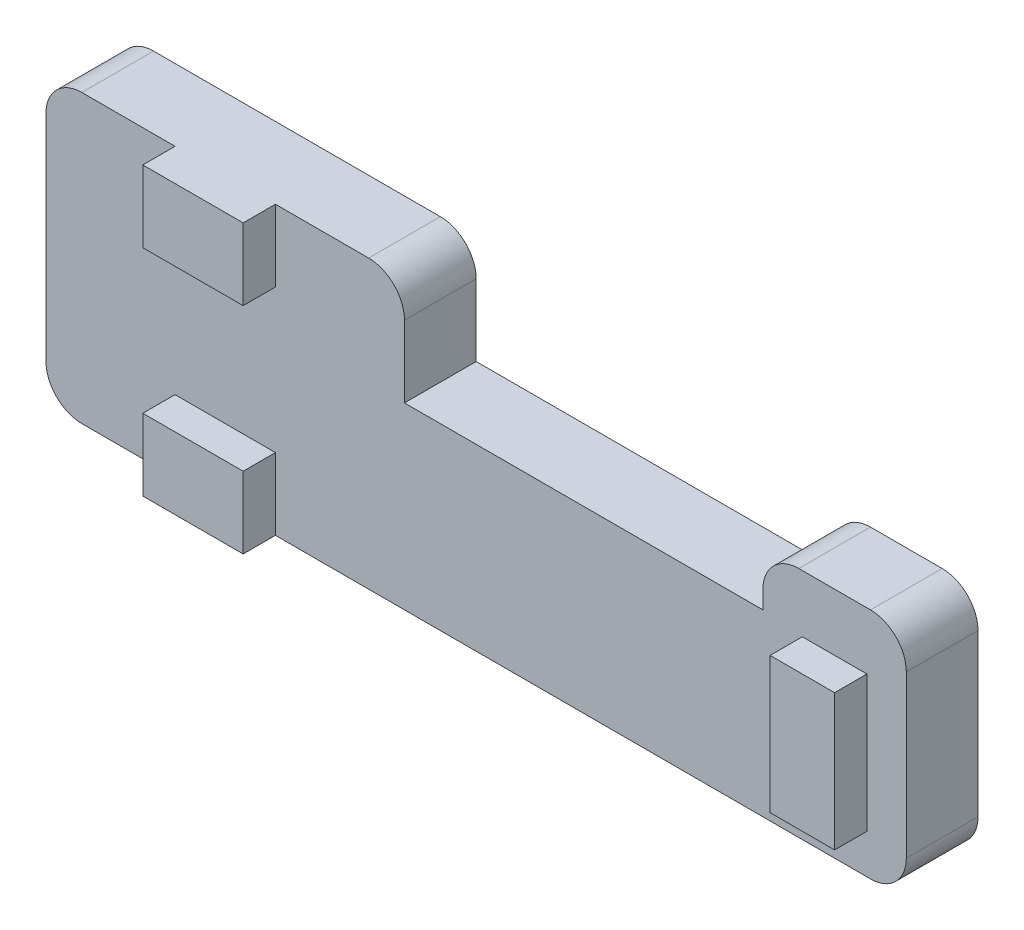
ISO-10303-21;
HEADER;
FILE_DESCRIPTION(('STEP AP214'),'2;1');
FILE_NAME('part.step','',(''),(''),'','','');
FILE_SCHEMA(('AUTOMOTIVE_DESIGN { 1 0 10303 214 1 1 1 1 }'));
ENDSEC;
DATA;
#1=APPLICATION_CONTEXT('core data for automotive mechanical design processes');
#2=APPLICATION_PROTOCOL_DEFINITION('international standard','automotive_design',2000,#1);
#3=PRODUCT_CONTEXT('',#1,'mechanical');
#4=PRODUCT('Part','Part','',(#3));
#5=PRODUCT_RELATED_PRODUCT_CATEGORY('part','',(#4));
#6=PRODUCT_DEFINITION_FORMATION('','',#4);
#7=PRODUCT_DEFINITION_CONTEXT('part definition',#1,'design');
#8=PRODUCT_DEFINITION('design','',#6,#7);
#9=PRODUCT_DEFINITION_SHAPE('','',#8);
#10=(LENGTH_UNIT() NAMED_UNIT(*) SI_UNIT(.MILLI.,.METRE.));
#11=(NAMED_UNIT(*) PLANE_ANGLE_UNIT() SI_UNIT($,.RADIAN.));
#12=(NAMED_UNIT(*) SI_UNIT($,.STERADIAN.) SOLID_ANGLE_UNIT());
#13=UNCERTAINTY_MEASURE_WITH_UNIT(LENGTH_MEASURE(1.E-05),#10,'distance_accuracy_value','');
#14=(GEOMETRIC_REPRESENTATION_CONTEXT(3) GLOBAL_UNCERTAINTY_ASSIGNED_CONTEXT((#13)) GLOBAL_UNIT_ASSIGNED_CONTEXT((#10,
#11,#12)) REPRESENTATION_CONTEXT('',''));
#15=CARTESIAN_POINT('',(0.,0.,0.));
#16=DIRECTION('',(0.,0.,1.));
#17=DIRECTION('',(1.,0.,0.));
#18=AXIS2_PLACEMENT_3D('',#15,#16,#17);
#19=CARTESIAN_POINT('',(0.,1.1,-17.1));
#20=DIRECTION('',(0.,-1.,0.));
#21=DIRECTION('',(1.,0.,0.));
#22=AXIS2_PLACEMENT_3D('',#19,#20,#21);
#23=PLANE('',#22);
#24=DIRECTION('',(0.,0.,1.));
#25=VECTOR('',#24,1.);
#26=CARTESIAN_POINT('',(11.1,1.1,-18.));
#27=LINE('',#26,#25);
#28=CARTESIAN_POINT('',(11.1,1.1,-18.));
#29=VERTEX_POINT('',#28);
#30=CARTESIAN_POINT('',(11.1,1.1,-17.1));
#31=VERTEX_POINT('',#30);
#32=EDGE_CURVE('E256',#29,#31,#27,.T.);
#33=ORIENTED_EDGE('',*,*,#32,.F.);
#34=DIRECTION('',(-1.,0.,0.));
#35=VECTOR('',#34,1.);
#36=CARTESIAN_POINT('',(0.,1.1,-18.));
#37=LINE('',#36,#35);
#38=CARTESIAN_POINT('',(12.9,1.1,-18.));
#39=VERTEX_POINT('',#38);
#40=EDGE_CURVE('E270',#39,#29,#37,.T.);
#41=ORIENTED_EDGE('',*,*,#40,.F.);
#42=DIRECTION('',(0.,0.,1.));
#43=VECTOR('',#42,1.);
#44=CARTESIAN_POINT('',(12.9,1.1,-18.));
#45=LINE('',#44,#43);
#46=CARTESIAN_POINT('',(12.9,1.1,-17.1));
#47=VERTEX_POINT('',#46);
#48=EDGE_CURVE('E488',#39,#47,#45,.T.);
#49=ORIENTED_EDGE('',*,*,#48,.T.);
#50=DIRECTION('',(-1.,0.,0.));
#51=VECTOR('',#50,1.);
#52=CARTESIAN_POINT('',(0.,1.1,-17.1));
#53=LINE('',#52,#51);
#54=EDGE_CURVE('E272',#47,#31,#53,.T.);
#55=ORIENTED_EDGE('',*,*,#54,.T.);
#56=EDGE_LOOP('',(#33,#41,#49,#55));
#57=FACE_BOUND('',#56,.T.);
#58=ADVANCED_FACE('F82',(#57),#23,.T.);
#59=CARTESIAN_POINT('',(0.,4.9,-17.1));
#60=DIRECTION('',(0.,-1.,0.));
#61=DIRECTION('',(0.,0.,-1.));
#62=AXIS2_PLACEMENT_3D('',#59,#60,#61);
#63=PLANE('',#62);
#64=DIRECTION('',(-1.,0.,0.));
#65=VECTOR('',#64,1.);
#66=CARTESIAN_POINT('',(0.,4.9,-18.));
#67=LINE('',#66,#65);
#68=CARTESIAN_POINT('',(12.9,4.9,-18.));
#69=VERTEX_POINT('',#68);
#70=CARTESIAN_POINT('',(11.1,4.9,-18.));
#71=VERTEX_POINT('',#70);
#72=EDGE_CURVE('E277',#69,#71,#67,.T.);
#73=ORIENTED_EDGE('',*,*,#72,.T.);
#74=DIRECTION('',(0.,0.,1.));
#75=VECTOR('',#74,1.);
#76=CARTESIAN_POINT('',(11.1,4.9,-18.));
#77=LINE('',#76,#75);
#78=CARTESIAN_POINT('',(11.1,4.9,-17.1));
#79=VERTEX_POINT('',#78);
#80=EDGE_CURVE('E259',#71,#79,#77,.T.);
#81=ORIENTED_EDGE('',*,*,#80,.T.);
#82=DIRECTION('',(-1.,0.,0.));
#83=VECTOR('',#82,1.);
#84=CARTESIAN_POINT('',(0.,4.9,-17.1));
#85=LINE('',#84,#83);
#86=CARTESIAN_POINT('',(12.9,4.9,-17.1));
#87=VERTEX_POINT('',#86);
#88=EDGE_CURVE('E284',#87,#79,#85,.T.);
#89=ORIENTED_EDGE('',*,*,#88,.F.);
#90=DIRECTION('',(0.,0.,1.));
#91=VECTOR('',#90,1.);
#92=CARTESIAN_POINT('',(12.9,4.9,-18.));
#93=LINE('',#92,#91);
#94=EDGE_CURVE('E483',#69,#87,#93,.T.);
#95=ORIENTED_EDGE('',*,*,#94,.F.);
#96=EDGE_LOOP('',(#73,#81,#89,#95));
#97=FACE_BOUND('',#96,.T.);
#98=ADVANCED_FACE('F482',(#97),#63,.F.);
#99=CARTESIAN_POINT('',(0.,0.,-17.1));
#100=DIRECTION('',(0.,0.,1.));
#101=DIRECTION('',(1.,0.,0.));
#102=AXIS2_PLACEMENT_3D('',#99,#100,#101);
#103=PLANE('',#102);
#104=DIRECTION('',(0.,1.,0.));
#105=VECTOR('',#104,1.);
#106=CARTESIAN_POINT('',(11.1,0.,-17.1));
#107=LINE('',#106,#105);
#108=EDGE_CURVE('E264',#31,#79,#107,.T.);
#109=ORIENTED_EDGE('',*,*,#108,.F.);
#110=ORIENTED_EDGE('',*,*,#54,.F.);
#111=DIRECTION('',(0.,1.,0.));
#112=VECTOR('',#111,1.);
#113=CARTESIAN_POINT('',(12.9,0.,-17.1));
#114=LINE('',#113,#112);
#115=EDGE_CURVE('E479',#47,#87,#114,.T.);
#116=ORIENTED_EDGE('',*,*,#115,.T.);
#117=ORIENTED_EDGE('',*,*,#88,.T.);
#118=EDGE_LOOP('',(#109,#110,#116,#117));
#119=FACE_BOUND('',#118,.T.);
#120=ADVANCED_FACE('F478',(#119),#103,.T.);
#121=CARTESIAN_POINT('',(14.,0.,0.));
#122=DIRECTION('',(1.,0.,0.));
#123=DIRECTION('',(0.,0.,-1.));
#124=AXIS2_PLACEMENT_3D('',#121,#122,#123);
#125=PLANE('',#124);
#126=DIRECTION('',(0.,-1.,0.));
#127=VECTOR('',#126,1.);
#128=CARTESIAN_POINT('',(14.,6.5,-18.));
#129=LINE('',#128,#127);
#130=CARTESIAN_POINT('',(14.,5.5,-18.));
#131=VERTEX_POINT('',#130);
#132=CARTESIAN_POINT('',(14.,1.,-18.));
#133=VERTEX_POINT('',#132);
#134=EDGE_CURVE('E386',#131,#133,#129,.T.);
#135=ORIENTED_EDGE('',*,*,#134,.T.);
#136=DIRECTION('',(0.,0.,-1.));
#137=VECTOR('',#136,1.);
#138=CARTESIAN_POINT('',(14.,1.,-20.));
#139=LINE('',#138,#137);
#140=CARTESIAN_POINT('',(14.,1.,-20.));
#141=VERTEX_POINT('',#140);
#142=EDGE_CURVE('E354',#133,#141,#139,.T.);
#143=ORIENTED_EDGE('',*,*,#142,.T.);
#144=DIRECTION('',(0.,1.,0.));
#145=VECTOR('',#144,1.);
#146=CARTESIAN_POINT('',(14.,0.,-20.));
#147=LINE('',#146,#145);
#148=CARTESIAN_POINT('',(14.,5.5,-20.));
#149=VERTEX_POINT('',#148);
#150=EDGE_CURVE('E396',#141,#149,#147,.T.);
#151=ORIENTED_EDGE('',*,*,#150,.T.);
#152=DIRECTION('',(0.,0.,1.));
#153=VECTOR('',#152,1.);
#154=CARTESIAN_POINT('',(14.,5.5,-18.));
#155=LINE('',#154,#153);
#156=EDGE_CURVE('E351',#149,#131,#155,.T.);
#157=ORIENTED_EDGE('',*,*,#156,.T.);
#158=EDGE_LOOP('',(#135,#143,#151,#157));
#159=FACE_BOUND('',#158,.T.);
#160=ADVANCED_FACE('F393',(#159),#125,.T.);
#161=CARTESIAN_POINT('',(0.,2.,-18.));
#162=DIRECTION('',(0.,0.,1.));
#163=DIRECTION('',(1.,0.,0.));
#164=AXIS2_PLACEMENT_3D('',#161,#162,#163);
#165=PLANE('',#164);
#166=ORIENTED_EDGE('',*,*,#40,.T.);
#167=DIRECTION('',(0.,1.,0.));
#168=VECTOR('',#167,1.);
#169=CARTESIAN_POINT('',(11.1,0.,-18.));
#170=LINE('',#169,#168);
#171=EDGE_CURVE('E253',#29,#71,#170,.T.);
#172=ORIENTED_EDGE('',*,*,#171,.T.);
#173=ORIENTED_EDGE('',*,*,#72,.F.);
#174=DIRECTION('',(0.,1.,0.));
#175=VECTOR('',#174,1.);
#176=CARTESIAN_POINT('',(12.9,0.,-18.));
#177=LINE('',#176,#175);
#178=EDGE_CURVE('E276',#39,#69,#177,.T.);
#179=ORIENTED_EDGE('',*,*,#178,.F.);
#180=EDGE_LOOP('',(#166,#172,#173,#179));
#181=FACE_BOUND('',#180,.T.);
#182=DIRECTION('',(1.,0.,0.));
#183=VECTOR('',#182,1.);
#184=CARTESIAN_POINT('',(-10.,8.,-18.));
#185=LINE('',#184,#183);
#186=CARTESIAN_POINT('',(-9.,8.,-18.));
#187=VERTEX_POINT('',#186);
#188=CARTESIAN_POINT('',(-6.4,8.,-18.));
#189=VERTEX_POINT('',#188);
#190=EDGE_CURVE('E281',#187,#189,#185,.T.);
#191=ORIENTED_EDGE('',*,*,#190,.F.);
#192=CARTESIAN_POINT('',(-9.,7.,-18.));
#193=DIRECTION('',(0.,0.,1.));
#194=DIRECTION('',(1.,0.,0.));
#195=AXIS2_PLACEMENT_3D('',#192,#193,#194);
#196=CIRCLE('',#195,1.);
#197=CARTESIAN_POINT('',(-10.,7.,-18.));
#198=VERTEX_POINT('',#197);
#199=EDGE_CURVE('E345',#187,#198,#196,.T.);
#200=ORIENTED_EDGE('',*,*,#199,.T.);
#201=DIRECTION('',(0.,1.,0.));
#202=VECTOR('',#201,1.);
#203=CARTESIAN_POINT('',(-10.,0.,-18.));
#204=LINE('',#203,#202);
#205=CARTESIAN_POINT('',(-10.,1.,-18.));
#206=VERTEX_POINT('',#205);
#207=EDGE_CURVE('E471',#206,#198,#204,.T.);
#208=ORIENTED_EDGE('',*,*,#207,.F.);
#209=CARTESIAN_POINT('',(-9.,1.,-18.));
#210=DIRECTION('',(0.,0.,1.));
#211=DIRECTION('',(1.,0.,0.));
#212=AXIS2_PLACEMENT_3D('',#209,#210,#211);
#213=CIRCLE('',#212,1.);
#214=CARTESIAN_POINT('',(-9.,0.,-18.));
#215=VERTEX_POINT('',#214);
#216=EDGE_CURVE('E97',#206,#215,#213,.T.);
#217=ORIENTED_EDGE('',*,*,#216,.T.);
#218=DIRECTION('',(1.,0.,0.));
#219=VECTOR('',#218,1.);
#220=CARTESIAN_POINT('',(-10.,0.,-18.));
#221=LINE('',#220,#219);
#222=CARTESIAN_POINT('',(-6.4,0.,-18.));
#223=VERTEX_POINT('',#222);
#224=EDGE_CURVE('E278',#215,#223,#221,.T.);
#225=ORIENTED_EDGE('',*,*,#224,.T.);
#226=DIRECTION('',(0.,-1.,0.));
#227=VECTOR('',#226,1.);
#228=CARTESIAN_POINT('',(-6.4,0.,-18.));
#229=LINE('',#228,#227);
#230=CARTESIAN_POINT('',(-6.4,2.,-18.));
#231=VERTEX_POINT('',#230);
#232=EDGE_CURVE('E415',#231,#223,#229,.T.);
#233=ORIENTED_EDGE('',*,*,#232,.F.);
#234=DIRECTION('',(-1.,0.,0.));
#235=VECTOR('',#234,1.);
#236=CARTESIAN_POINT('',(-3.6,2.,-18.));
#237=LINE('',#236,#235);
#238=CARTESIAN_POINT('',(-3.6,2.,-18.));
#239=VERTEX_POINT('',#238);
#240=EDGE_CURVE('E424',#239,#231,#237,.T.);
#241=ORIENTED_EDGE('',*,*,#240,.F.);
#242=DIRECTION('',(0.,1.,0.));
#243=VECTOR('',#242,1.);
#244=CARTESIAN_POINT('',(-3.6,0.,-18.));
#245=LINE('',#244,#243);
#246=CARTESIAN_POINT('',(-3.6,0.,-18.));
#247=VERTEX_POINT('',#246);
#248=EDGE_CURVE('E410',#247,#239,#245,.T.);
#249=ORIENTED_EDGE('',*,*,#248,.F.);
#250=DIRECTION('',(-1.,0.,0.));
#251=VECTOR('',#250,1.);
#252=CARTESIAN_POINT('',(0.,0.,-18.));
#253=LINE('',#252,#251);
#254=CARTESIAN_POINT('',(13.,0.,-18.));
#255=VERTEX_POINT('',#254);
#256=EDGE_CURVE('E308',#255,#247,#253,.T.);
#257=ORIENTED_EDGE('',*,*,#256,.F.);
#258=CARTESIAN_POINT('',(13.,1.,-18.));
#259=DIRECTION('',(0.,0.,1.));
#260=DIRECTION('',(1.,0.,0.));
#261=AXIS2_PLACEMENT_3D('',#258,#259,#260);
#262=CIRCLE('',#261,1.);
#263=EDGE_CURVE('E342',#255,#133,#262,.T.);
#264=ORIENTED_EDGE('',*,*,#263,.T.);
#265=ORIENTED_EDGE('',*,*,#134,.F.);
#266=CARTESIAN_POINT('',(13.,5.5,-18.));
#267=DIRECTION('',(0.,0.,1.));
#268=DIRECTION('',(1.,0.,0.));
#269=AXIS2_PLACEMENT_3D('',#266,#267,#268);
#270=CIRCLE('',#269,1.);
#271=CARTESIAN_POINT('',(13.,6.5,-18.));
#272=VERTEX_POINT('',#271);
#273=EDGE_CURVE('E340',#131,#272,#270,.T.);
#274=ORIENTED_EDGE('',*,*,#273,.T.);
#275=DIRECTION('',(-1.,0.,0.));
#276=VECTOR('',#275,1.);
#277=CARTESIAN_POINT('',(0.,6.5,-18.));
#278=LINE('',#277,#276);
#279=CARTESIAN_POINT('',(11.,6.5,-18.));
#280=VERTEX_POINT('',#279);
#281=EDGE_CURVE('E293',#272,#280,#278,.T.);
#282=ORIENTED_EDGE('',*,*,#281,.T.);
#283=CARTESIAN_POINT('',(11.,5.5,-18.));
#284=DIRECTION('',(0.,0.,1.));
#285=DIRECTION('',(1.,0.,0.));
#286=AXIS2_PLACEMENT_3D('',#283,#284,#285);
#287=CIRCLE('',#286,1.);
#288=CARTESIAN_POINT('',(10.,5.5,-18.));
#289=VERTEX_POINT('',#288);
#290=EDGE_CURVE('E338',#280,#289,#287,.T.);
#291=ORIENTED_EDGE('',*,*,#290,.T.);
#292=DIRECTION('',(0.,1.,0.));
#293=VECTOR('',#292,1.);
#294=CARTESIAN_POINT('',(10.,2.,-18.));
#295=LINE('',#294,#293);
#296=CARTESIAN_POINT('',(10.,5.,-18.));
#297=VERTEX_POINT('',#296);
#298=EDGE_CURVE('E290',#297,#289,#295,.T.);
#299=ORIENTED_EDGE('',*,*,#298,.F.);
#300=DIRECTION('',(-1.,0.,0.));
#301=VECTOR('',#300,1.);
#302=CARTESIAN_POINT('',(12.,5.,-18.));
#303=LINE('',#302,#301);
#304=CARTESIAN_POINT('',(0.,5.,-18.));
#305=VERTEX_POINT('',#304);
#306=EDGE_CURVE('E405',#297,#305,#303,.T.);
#307=ORIENTED_EDGE('',*,*,#306,.T.);
#308=DIRECTION('',(0.,-1.,0.));
#309=VECTOR('',#308,1.);
#310=CARTESIAN_POINT('',(0.,0.,-18.));
#311=LINE('',#310,#309);
#312=CARTESIAN_POINT('',(0.,7.,-18.));
#313=VERTEX_POINT('',#312);
#314=EDGE_CURVE('E296',#313,#305,#311,.T.);
#315=ORIENTED_EDGE('',*,*,#314,.F.);
#316=CARTESIAN_POINT('',(-1.,7.,-18.));
#317=DIRECTION('',(0.,0.,1.));
#318=DIRECTION('',(1.,0.,0.));
#319=AXIS2_PLACEMENT_3D('',#316,#317,#318);
#320=CIRCLE('',#319,1.);
#321=CARTESIAN_POINT('',(-1.,8.,-18.));
#322=VERTEX_POINT('',#321);
#323=EDGE_CURVE('E336',#313,#322,#320,.T.);
#324=ORIENTED_EDGE('',*,*,#323,.T.);
#325=DIRECTION('',(1.,0.,0.));
#326=VECTOR('',#325,1.);
#327=CARTESIAN_POINT('',(-14.,8.,-18.));
#328=LINE('',#327,#326);
#329=CARTESIAN_POINT('',(-3.6,8.,-18.));
#330=VERTEX_POINT('',#329);
#331=EDGE_CURVE('E287',#330,#322,#328,.T.);
#332=ORIENTED_EDGE('',*,*,#331,.F.);
#333=DIRECTION('',(0.,1.,0.));
#334=VECTOR('',#333,1.);
#335=CARTESIAN_POINT('',(-3.6,8.,-18.));
#336=LINE('',#335,#334);
#337=CARTESIAN_POINT('',(-3.6,6.,-18.));
#338=VERTEX_POINT('',#337);
#339=EDGE_CURVE('E440',#338,#330,#336,.T.);
#340=ORIENTED_EDGE('',*,*,#339,.F.);
#341=DIRECTION('',(1.,0.,0.));
#342=VECTOR('',#341,1.);
#343=CARTESIAN_POINT('',(-3.6,6.,-18.));
#344=LINE('',#343,#342);
#345=CARTESIAN_POINT('',(-6.4,6.,-18.));
#346=VERTEX_POINT('',#345);
#347=EDGE_CURVE('E445',#346,#338,#344,.T.);
#348=ORIENTED_EDGE('',*,*,#347,.F.);
#349=DIRECTION('',(0.,-1.,0.));
#350=VECTOR('',#349,1.);
#351=CARTESIAN_POINT('',(-6.4,8.,-18.));
#352=LINE('',#351,#350);
#353=EDGE_CURVE('E454',#189,#346,#352,.T.);
#354=ORIENTED_EDGE('',*,*,#353,.F.);
#355=EDGE_LOOP('',(#191,#200,#208,#217,#225,#233,#241,#249,#257,#264,#265,#274,#282,#291,#299,
#307,#315,#324,#332,#340,#348,#354));
#356=FACE_BOUND('',#355,.T.);
#357=ADVANCED_FACE('F275',(#181,#356),#165,.T.);
#358=CARTESIAN_POINT('',(0.,0.,0.));
#359=DIRECTION('',(0.,1.,0.));
#360=DIRECTION('',(0.,0.,1.));
#361=AXIS2_PLACEMENT_3D('',#358,#359,#360);
#362=PLANE('',#361);
#363=ORIENTED_EDGE('',*,*,#224,.F.);
#364=DIRECTION('',(0.,0.,1.));
#365=VECTOR('',#364,1.);
#366=CARTESIAN_POINT('',(-9.,0.,-20.));
#367=LINE('',#366,#365);
#368=CARTESIAN_POINT('',(-9.,0.,-20.));
#369=VERTEX_POINT('',#368);
#370=EDGE_CURVE('E349',#215,#369,#367,.F.);
#371=ORIENTED_EDGE('',*,*,#370,.T.);
#372=DIRECTION('',(-1.,0.,0.));
#373=VECTOR('',#372,1.);
#374=CARTESIAN_POINT('',(0.,0.,-20.));
#375=LINE('',#374,#373);
#376=CARTESIAN_POINT('',(13.,0.,-20.));
#377=VERTEX_POINT('',#376);
#378=EDGE_CURVE('E310',#377,#369,#375,.T.);
#379=ORIENTED_EDGE('',*,*,#378,.F.);
#380=DIRECTION('',(0.,0.,-1.));
#381=VECTOR('',#380,1.);
#382=CARTESIAN_POINT('',(13.,0.,-18.));
#383=LINE('',#382,#381);
#384=EDGE_CURVE('E347',#377,#255,#383,.F.);
#385=ORIENTED_EDGE('',*,*,#384,.T.);
#386=ORIENTED_EDGE('',*,*,#256,.T.);
#387=DIRECTION('',(0.,0.,-1.));
#388=VECTOR('',#387,1.);
#389=CARTESIAN_POINT('',(-3.6,0.,-17.1));
#390=LINE('',#389,#388);
#391=CARTESIAN_POINT('',(-3.6,0.,-17.1));
#392=VERTEX_POINT('',#391);
#393=EDGE_CURVE('E437',#392,#247,#390,.T.);
#394=ORIENTED_EDGE('',*,*,#393,.F.);
#395=DIRECTION('',(1.,0.,0.));
#396=VECTOR('',#395,1.);
#397=CARTESIAN_POINT('',(-3.6,0.,-17.1));
#398=LINE('',#397,#396);
#399=CARTESIAN_POINT('',(-6.4,0.,-17.1));
#400=VERTEX_POINT('',#399);
#401=EDGE_CURVE('E411',#400,#392,#398,.T.);
#402=ORIENTED_EDGE('',*,*,#401,.F.);
#403=DIRECTION('',(0.,0.,-1.));
#404=VECTOR('',#403,1.);
#405=CARTESIAN_POINT('',(-6.4,0.,-17.1));
#406=LINE('',#405,#404);
#407=EDGE_CURVE('E421',#400,#223,#406,.T.);
#408=ORIENTED_EDGE('',*,*,#407,.T.);
#409=EDGE_LOOP('',(#363,#371,#379,#385,#386,#394,#402,#408));
#410=FACE_BOUND('',#409,.T.);
#411=ADVANCED_FACE('F524',(#410),#362,.F.);
#412=CARTESIAN_POINT('',(10.,2.,0.));
#413=DIRECTION('',(-1.,0.,0.));
#414=DIRECTION('',(0.,0.,1.));
#415=AXIS2_PLACEMENT_3D('',#412,#413,#414);
#416=PLANE('',#415);
#417=ORIENTED_EDGE('',*,*,#298,.T.);
#418=DIRECTION('',(0.,0.,1.));
#419=VECTOR('',#418,1.);
#420=CARTESIAN_POINT('',(10.,5.5,-20.));
#421=LINE('',#420,#419);
#422=CARTESIAN_POINT('',(10.,5.5,-20.));
#423=VERTEX_POINT('',#422);
#424=EDGE_CURVE('E90',#289,#423,#421,.F.);
#425=ORIENTED_EDGE('',*,*,#424,.T.);
#426=DIRECTION('',(0.,-1.,0.));
#427=VECTOR('',#426,1.);
#428=CARTESIAN_POINT('',(10.,6.5,-20.));
#429=LINE('',#428,#427);
#430=CARTESIAN_POINT('',(10.,5.,-20.));
#431=VERTEX_POINT('',#430);
#432=EDGE_CURVE('E306',#423,#431,#429,.T.);
#433=ORIENTED_EDGE('',*,*,#432,.T.);
#434=DIRECTION('',(0.,0.,-1.));
#435=VECTOR('',#434,1.);
#436=CARTESIAN_POINT('',(10.,5.,0.));
#437=LINE('',#436,#435);
#438=EDGE_CURVE('E408',#297,#431,#437,.T.);
#439=ORIENTED_EDGE('',*,*,#438,.F.);
#440=EDGE_LOOP('',(#417,#425,#433,#439));
#441=FACE_BOUND('',#440,.T.);
#442=ADVANCED_FACE('F364',(#441),#416,.T.);
#443=CARTESIAN_POINT('',(0.,6.5,0.));
#444=DIRECTION('',(0.,-1.,0.));
#445=DIRECTION('',(0.,0.,-1.));
#446=AXIS2_PLACEMENT_3D('',#443,#444,#445);
#447=PLANE('',#446);
#448=ORIENTED_EDGE('',*,*,#281,.F.);
#449=DIRECTION('',(0.,0.,1.));
#450=VECTOR('',#449,1.);
#451=CARTESIAN_POINT('',(13.,6.5,-20.));
#452=LINE('',#451,#450);
#453=CARTESIAN_POINT('',(13.,6.5,-20.));
#454=VERTEX_POINT('',#453);
#455=EDGE_CURVE('E360',#272,#454,#452,.F.);
#456=ORIENTED_EDGE('',*,*,#455,.T.);
#457=DIRECTION('',(-1.,0.,0.));
#458=VECTOR('',#457,1.);
#459=CARTESIAN_POINT('',(12.,6.5,-20.));
#460=LINE('',#459,#458);
#461=CARTESIAN_POINT('',(11.,6.5,-20.));
#462=VERTEX_POINT('',#461);
#463=EDGE_CURVE('E303',#454,#462,#460,.T.);
#464=ORIENTED_EDGE('',*,*,#463,.T.);
#465=DIRECTION('',(0.,0.,1.));
#466=VECTOR('',#465,1.);
#467=CARTESIAN_POINT('',(11.,6.5,-18.));
#468=LINE('',#467,#466);
#469=EDGE_CURVE('E357',#462,#280,#468,.T.);
#470=ORIENTED_EDGE('',*,*,#469,.T.);
#471=EDGE_LOOP('',(#448,#456,#464,#470));
#472=FACE_BOUND('',#471,.T.);
#473=ADVANCED_FACE('F381',(#472),#447,.F.);
#474=CARTESIAN_POINT('',(0.,0.,0.));
#475=DIRECTION('',(-1.,0.,0.));
#476=DIRECTION('',(0.,0.,1.));
#477=AXIS2_PLACEMENT_3D('',#474,#475,#476);
#478=PLANE('',#477);
#479=DIRECTION('',(0.,-1.,0.));
#480=VECTOR('',#479,1.);
#481=CARTESIAN_POINT('',(0.,0.,-20.));
#482=LINE('',#481,#480);
#483=CARTESIAN_POINT('',(0.,7.,-20.));
#484=VERTEX_POINT('',#483);
#485=CARTESIAN_POINT('',(0.,5.,-20.));
#486=VERTEX_POINT('',#485);
#487=EDGE_CURVE('E298',#484,#486,#482,.T.);
#488=ORIENTED_EDGE('',*,*,#487,.F.);
#489=DIRECTION('',(0.,0.,-1.));
#490=VECTOR('',#489,1.);
#491=CARTESIAN_POINT('',(0.,7.,-18.));
#492=LINE('',#491,#490);
#493=EDGE_CURVE('E12',#484,#313,#492,.F.);
#494=ORIENTED_EDGE('',*,*,#493,.T.);
#495=ORIENTED_EDGE('',*,*,#314,.T.);
#496=DIRECTION('',(0.,0.,-1.));
#497=VECTOR('',#496,1.);
#498=CARTESIAN_POINT('',(0.,5.,0.));
#499=LINE('',#498,#497);
#500=EDGE_CURVE('E397',#305,#486,#499,.T.);
#501=ORIENTED_EDGE('',*,*,#500,.T.);
#502=EDGE_LOOP('',(#488,#494,#495,#501));
#503=FACE_BOUND('',#502,.T.);
#504=ADVANCED_FACE('F513',(#503),#478,.F.);
#505=CARTESIAN_POINT('',(0.,8.,-20.));
#506=DIRECTION('',(0.,1.,0.));
#507=DIRECTION('',(0.,0.,1.));
#508=AXIS2_PLACEMENT_3D('',#505,#506,#507);
#509=PLANE('',#508);
#510=DIRECTION('',(-1.,0.,0.));
#511=VECTOR('',#510,1.);
#512=CARTESIAN_POINT('',(0.,8.,-20.));
#513=LINE('',#512,#511);
#514=CARTESIAN_POINT('',(-1.,8.,-20.));
#515=VERTEX_POINT('',#514);
#516=CARTESIAN_POINT('',(-9.,8.,-20.));
#517=VERTEX_POINT('',#516);
#518=EDGE_CURVE('E300',#515,#517,#513,.T.);
#519=ORIENTED_EDGE('',*,*,#518,.T.);
#520=DIRECTION('',(0.,0.,-1.));
#521=VECTOR('',#520,1.);
#522=CARTESIAN_POINT('',(-9.,8.,-20.));
#523=LINE('',#522,#521);
#524=EDGE_CURVE('E334',#517,#187,#523,.F.);
#525=ORIENTED_EDGE('',*,*,#524,.T.);
#526=ORIENTED_EDGE('',*,*,#190,.T.);
#527=DIRECTION('',(0.,0.,-1.));
#528=VECTOR('',#527,1.);
#529=CARTESIAN_POINT('',(-6.4,8.,-17.1));
#530=LINE('',#529,#528);
#531=CARTESIAN_POINT('',(-6.4,8.,-17.1));
#532=VERTEX_POINT('',#531);
#533=EDGE_CURVE('E462',#532,#189,#530,.T.);
#534=ORIENTED_EDGE('',*,*,#533,.F.);
#535=DIRECTION('',(-1.,0.,0.));
#536=VECTOR('',#535,1.);
#537=CARTESIAN_POINT('',(-3.6,8.,-17.1));
#538=LINE('',#537,#536);
#539=CARTESIAN_POINT('',(-3.6,8.,-17.1));
#540=VERTEX_POINT('',#539);
#541=EDGE_CURVE('E444',#540,#532,#538,.T.);
#542=ORIENTED_EDGE('',*,*,#541,.F.);
#543=DIRECTION('',(0.,0.,-1.));
#544=VECTOR('',#543,1.);
#545=CARTESIAN_POINT('',(-3.6,8.,-17.1));
#546=LINE('',#545,#544);
#547=EDGE_CURVE('E465',#540,#330,#546,.T.);
#548=ORIENTED_EDGE('',*,*,#547,.T.);
#549=ORIENTED_EDGE('',*,*,#331,.T.);
#550=DIRECTION('',(0.,0.,-1.));
#551=VECTOR('',#550,1.);
#552=CARTESIAN_POINT('',(-1.,8.,-20.));
#553=LINE('',#552,#551);
#554=EDGE_CURVE('E331',#322,#515,#553,.T.);
#555=ORIENTED_EDGE('',*,*,#554,.T.);
#556=EDGE_LOOP('',(#519,#525,#526,#534,#542,#548,#549,#555));
#557=FACE_BOUND('',#556,.T.);
#558=ADVANCED_FACE('F516',(#557),#509,.T.);
#559=CARTESIAN_POINT('',(0.,2.,-20.));
#560=DIRECTION('',(0.,0.,1.));
#561=DIRECTION('',(1.,0.,0.));
#562=AXIS2_PLACEMENT_3D('',#559,#560,#561);
#563=PLANE('',#562);
#564=DIRECTION('',(0.,-1.,0.));
#565=VECTOR('',#564,1.);
#566=CARTESIAN_POINT('',(-10.,0.,-20.));
#567=LINE('',#566,#565);
#568=CARTESIAN_POINT('',(-10.,7.,-20.));
#569=VERTEX_POINT('',#568);
#570=CARTESIAN_POINT('',(-10.,1.,-20.));
#571=VERTEX_POINT('',#570);
#572=EDGE_CURVE('E468',#569,#571,#567,.T.);
#573=ORIENTED_EDGE('',*,*,#572,.F.);
#574=CARTESIAN_POINT('',(-9.,7.,-20.));
#575=DIRECTION('',(0.,0.,1.));
#576=DIRECTION('',(1.,0.,0.));
#577=AXIS2_PLACEMENT_3D('',#574,#575,#576);
#578=CIRCLE('',#577,1.);
#579=EDGE_CURVE('E329',#569,#517,#578,.F.);
#580=ORIENTED_EDGE('',*,*,#579,.T.);
#581=ORIENTED_EDGE('',*,*,#518,.F.);
#582=CARTESIAN_POINT('',(-1.,7.,-20.));
#583=DIRECTION('',(0.,0.,1.));
#584=DIRECTION('',(1.,0.,0.));
#585=AXIS2_PLACEMENT_3D('',#582,#583,#584);
#586=CIRCLE('',#585,1.);
#587=EDGE_CURVE('E319',#515,#484,#586,.F.);
#588=ORIENTED_EDGE('',*,*,#587,.T.);
#589=ORIENTED_EDGE('',*,*,#487,.T.);
#590=DIRECTION('',(-1.,0.,0.));
#591=VECTOR('',#590,1.);
#592=CARTESIAN_POINT('',(12.,5.,-20.));
#593=LINE('',#592,#591);
#594=EDGE_CURVE('E376',#431,#486,#593,.T.);
#595=ORIENTED_EDGE('',*,*,#594,.F.);
#596=ORIENTED_EDGE('',*,*,#432,.F.);
#597=CARTESIAN_POINT('',(11.,5.5,-20.));
#598=DIRECTION('',(0.,0.,1.));
#599=DIRECTION('',(1.,0.,0.));
#600=AXIS2_PLACEMENT_3D('',#597,#598,#599);
#601=CIRCLE('',#600,1.);
#602=EDGE_CURVE('E321',#423,#462,#601,.F.);
#603=ORIENTED_EDGE('',*,*,#602,.T.);
#604=ORIENTED_EDGE('',*,*,#463,.F.);
#605=CARTESIAN_POINT('',(13.,5.5,-20.));
#606=DIRECTION('',(0.,0.,1.));
#607=DIRECTION('',(1.,0.,0.));
#608=AXIS2_PLACEMENT_3D('',#605,#606,#607);
#609=CIRCLE('',#608,1.);
#610=EDGE_CURVE('E323',#454,#149,#609,.F.);
#611=ORIENTED_EDGE('',*,*,#610,.T.);
#612=ORIENTED_EDGE('',*,*,#150,.F.);
#613=CARTESIAN_POINT('',(13.,1.,-20.));
#614=DIRECTION('',(0.,0.,1.));
#615=DIRECTION('',(1.,0.,0.));
#616=AXIS2_PLACEMENT_3D('',#613,#614,#615);
#617=CIRCLE('',#616,1.);
#618=EDGE_CURVE('E325',#141,#377,#617,.F.);
#619=ORIENTED_EDGE('',*,*,#618,.T.);
#620=ORIENTED_EDGE('',*,*,#378,.T.);
#621=CARTESIAN_POINT('',(-9.,1.,-20.));
#622=DIRECTION('',(0.,0.,1.));
#623=DIRECTION('',(1.,0.,0.));
#624=AXIS2_PLACEMENT_3D('',#621,#622,#623);
#625=CIRCLE('',#624,1.);
#626=EDGE_CURVE('E327',#369,#571,#625,.F.);
#627=ORIENTED_EDGE('',*,*,#626,.T.);
#628=EDGE_LOOP('',(#573,#580,#581,#588,#589,#595,#596,#603,#604,#611,#612,#619,#620,#627));
#629=FACE_BOUND('',#628,.T.);
#630=ADVANCED_FACE('F373',(#629),#563,.F.);
#631=CARTESIAN_POINT('',(-10.,0.,0.));
#632=DIRECTION('',(-1.,0.,0.));
#633=DIRECTION('',(0.,0.,1.));
#634=AXIS2_PLACEMENT_3D('',#631,#632,#633);
#635=PLANE('',#634);
#636=ORIENTED_EDGE('',*,*,#207,.T.);
#637=DIRECTION('',(0.,0.,-1.));
#638=VECTOR('',#637,1.);
#639=CARTESIAN_POINT('',(-10.,7.,0.));
#640=LINE('',#639,#638);
#641=EDGE_CURVE('E316',#198,#569,#640,.T.);
#642=ORIENTED_EDGE('',*,*,#641,.T.);
#643=ORIENTED_EDGE('',*,*,#572,.T.);
#644=DIRECTION('',(0.,0.,1.));
#645=VECTOR('',#644,1.);
#646=CARTESIAN_POINT('',(-10.,1.,-18.));
#647=LINE('',#646,#645);
#648=EDGE_CURVE('E313',#571,#206,#647,.T.);
#649=ORIENTED_EDGE('',*,*,#648,.T.);
#650=EDGE_LOOP('',(#636,#642,#643,#649));
#651=FACE_BOUND('',#650,.T.);
#652=ADVANCED_FACE('F531',(#651),#635,.T.);
#653=CARTESIAN_POINT('',(-3.6,8.,-17.1));
#654=DIRECTION('',(-1.,0.,0.));
#655=DIRECTION('',(0.,-1.,0.));
#656=AXIS2_PLACEMENT_3D('',#653,#654,#655);
#657=PLANE('',#656);
#658=ORIENTED_EDGE('',*,*,#339,.T.);
#659=ORIENTED_EDGE('',*,*,#547,.F.);
#660=DIRECTION('',(0.,1.,0.));
#661=VECTOR('',#660,1.);
#662=CARTESIAN_POINT('',(-3.6,8.,-17.1));
#663=LINE('',#662,#661);
#664=CARTESIAN_POINT('',(-3.6,6.,-17.1));
#665=VERTEX_POINT('',#664);
#666=EDGE_CURVE('E441',#665,#540,#663,.T.);
#667=ORIENTED_EDGE('',*,*,#666,.F.);
#668=DIRECTION('',(0.,0.,-1.));
#669=VECTOR('',#668,1.);
#670=CARTESIAN_POINT('',(-3.6,6.,-17.1));
#671=LINE('',#670,#669);
#672=EDGE_CURVE('E451',#665,#338,#671,.T.);
#673=ORIENTED_EDGE('',*,*,#672,.T.);
#674=EDGE_LOOP('',(#658,#659,#667,#673));
#675=FACE_BOUND('',#674,.T.);
#676=ADVANCED_FACE('F556',(#675),#657,.F.);
#677=CARTESIAN_POINT('',(-6.4,8.,-17.1));
#678=DIRECTION('',(1.,0.,0.));
#679=DIRECTION('',(0.,0.,-1.));
#680=AXIS2_PLACEMENT_3D('',#677,#678,#679);
#681=PLANE('',#680);
#682=ORIENTED_EDGE('',*,*,#353,.T.);
#683=DIRECTION('',(0.,0.,-1.));
#684=VECTOR('',#683,1.);
#685=CARTESIAN_POINT('',(-6.4,6.,-17.1));
#686=LINE('',#685,#684);
#687=CARTESIAN_POINT('',(-6.4,6.,-17.1));
#688=VERTEX_POINT('',#687);
#689=EDGE_CURVE('E459',#688,#346,#686,.T.);
#690=ORIENTED_EDGE('',*,*,#689,.F.);
#691=DIRECTION('',(0.,-1.,0.));
#692=VECTOR('',#691,1.);
#693=CARTESIAN_POINT('',(-6.4,8.,-17.1));
#694=LINE('',#693,#692);
#695=EDGE_CURVE('E447',#532,#688,#694,.T.);
#696=ORIENTED_EDGE('',*,*,#695,.F.);
#697=ORIENTED_EDGE('',*,*,#533,.T.);
#698=EDGE_LOOP('',(#682,#690,#696,#697));
#699=FACE_BOUND('',#698,.T.);
#700=ADVANCED_FACE('F566',(#699),#681,.F.);
#701=CARTESIAN_POINT('',(-3.6,6.,-17.1));
#702=DIRECTION('',(0.,1.,0.));
#703=DIRECTION('',(0.,0.,1.));
#704=AXIS2_PLACEMENT_3D('',#701,#702,#703);
#705=PLANE('',#704);
#706=ORIENTED_EDGE('',*,*,#347,.T.);
#707=ORIENTED_EDGE('',*,*,#672,.F.);
#708=DIRECTION('',(1.,0.,0.));
#709=VECTOR('',#708,1.);
#710=CARTESIAN_POINT('',(-3.6,6.,-17.1));
#711=LINE('',#710,#709);
#712=EDGE_CURVE('E449',#688,#665,#711,.T.);
#713=ORIENTED_EDGE('',*,*,#712,.F.);
#714=ORIENTED_EDGE('',*,*,#689,.T.);
#715=EDGE_LOOP('',(#706,#707,#713,#714));
#716=FACE_BOUND('',#715,.T.);
#717=ADVANCED_FACE('F561',(#716),#705,.F.);
#718=CARTESIAN_POINT('',(0.,0.,-17.1));
#719=DIRECTION('',(0.,0.,-1.));
#720=DIRECTION('',(-1.,0.,0.));
#721=AXIS2_PLACEMENT_3D('',#718,#719,#720);
#722=PLANE('',#721);
#723=ORIENTED_EDGE('',*,*,#666,.T.);
#724=ORIENTED_EDGE('',*,*,#541,.T.);
#725=ORIENTED_EDGE('',*,*,#695,.T.);
#726=ORIENTED_EDGE('',*,*,#712,.T.);
#727=EDGE_LOOP('',(#723,#724,#725,#726));
#728=FACE_BOUND('',#727,.T.);
#729=ADVANCED_FACE('F608',(#728),#722,.F.);
#730=CARTESIAN_POINT('',(-3.6,0.,-17.1));
#731=DIRECTION('',(-1.,0.,0.));
#732=DIRECTION('',(0.,-1.,0.));
#733=AXIS2_PLACEMENT_3D('',#730,#731,#732);
#734=PLANE('',#733);
#735=ORIENTED_EDGE('',*,*,#248,.T.);
#736=DIRECTION('',(0.,0.,-1.));
#737=VECTOR('',#736,1.);
#738=CARTESIAN_POINT('',(-3.6,2.,-17.1));
#739=LINE('',#738,#737);
#740=CARTESIAN_POINT('',(-3.6,2.,-17.1));
#741=VERTEX_POINT('',#740);
#742=EDGE_CURVE('E434',#741,#239,#739,.T.);
#743=ORIENTED_EDGE('',*,*,#742,.F.);
#744=DIRECTION('',(0.,1.,0.));
#745=VECTOR('',#744,1.);
#746=CARTESIAN_POINT('',(-3.6,0.,-17.1));
#747=LINE('',#746,#745);
#748=EDGE_CURVE('E414',#392,#741,#747,.T.);
#749=ORIENTED_EDGE('',*,*,#748,.F.);
#750=ORIENTED_EDGE('',*,*,#393,.T.);
#751=EDGE_LOOP('',(#735,#743,#749,#750));
#752=FACE_BOUND('',#751,.T.);
#753=ADVANCED_FACE('F589',(#752),#734,.F.);
#754=CARTESIAN_POINT('',(-3.6,2.,-17.1));
#755=DIRECTION('',(0.,-1.,0.));
#756=DIRECTION('',(0.,0.,-1.));
#757=AXIS2_PLACEMENT_3D('',#754,#755,#756);
#758=PLANE('',#757);
#759=ORIENTED_EDGE('',*,*,#240,.T.);
#760=DIRECTION('',(0.,0.,-1.));
#761=VECTOR('',#760,1.);
#762=CARTESIAN_POINT('',(-6.4,2.,-17.1));
#763=LINE('',#762,#761);
#764=CARTESIAN_POINT('',(-6.4,2.,-17.1));
#765=VERTEX_POINT('',#764);
#766=EDGE_CURVE('E431',#765,#231,#763,.T.);
#767=ORIENTED_EDGE('',*,*,#766,.F.);
#768=DIRECTION('',(-1.,0.,0.));
#769=VECTOR('',#768,1.);
#770=CARTESIAN_POINT('',(-3.6,2.,-17.1));
#771=LINE('',#770,#769);
#772=EDGE_CURVE('E417',#741,#765,#771,.T.);
#773=ORIENTED_EDGE('',*,*,#772,.F.);
#774=ORIENTED_EDGE('',*,*,#742,.T.);
#775=EDGE_LOOP('',(#759,#767,#773,#774));
#776=FACE_BOUND('',#775,.T.);
#777=ADVANCED_FACE('F584',(#776),#758,.F.);
#778=CARTESIAN_POINT('',(-6.4,0.,-17.1));
#779=DIRECTION('',(1.,0.,0.));
#780=DIRECTION('',(0.,0.,-1.));
#781=AXIS2_PLACEMENT_3D('',#778,#779,#780);
#782=PLANE('',#781);
#783=ORIENTED_EDGE('',*,*,#232,.T.);
#784=ORIENTED_EDGE('',*,*,#407,.F.);
#785=DIRECTION('',(0.,-1.,0.));
#786=VECTOR('',#785,1.);
#787=CARTESIAN_POINT('',(-6.4,0.,-17.1));
#788=LINE('',#787,#786);
#789=EDGE_CURVE('E419',#765,#400,#788,.T.);
#790=ORIENTED_EDGE('',*,*,#789,.F.);
#791=ORIENTED_EDGE('',*,*,#766,.T.);
#792=EDGE_LOOP('',(#783,#784,#790,#791));
#793=FACE_BOUND('',#792,.T.);
#794=ADVANCED_FACE('F579',(#793),#782,.F.);
#795=CARTESIAN_POINT('',(0.,0.,-17.1));
#796=DIRECTION('',(0.,0.,-1.));
#797=DIRECTION('',(-1.,0.,0.));
#798=AXIS2_PLACEMENT_3D('',#795,#796,#797);
#799=PLANE('',#798);
#800=ORIENTED_EDGE('',*,*,#401,.T.);
#801=ORIENTED_EDGE('',*,*,#748,.T.);
#802=ORIENTED_EDGE('',*,*,#772,.T.);
#803=ORIENTED_EDGE('',*,*,#789,.T.);
#804=EDGE_LOOP('',(#800,#801,#802,#803));
#805=FACE_BOUND('',#804,.T.);
#806=ADVANCED_FACE('F593',(#805),#799,.F.);
#807=CARTESIAN_POINT('',(12.,5.,0.));
#808=DIRECTION('',(0.,1.,0.));
#809=DIRECTION('',(0.,0.,1.));
#810=AXIS2_PLACEMENT_3D('',#807,#808,#809);
#811=PLANE('',#810);
#812=ORIENTED_EDGE('',*,*,#306,.F.);
#813=ORIENTED_EDGE('',*,*,#438,.T.);
#814=ORIENTED_EDGE('',*,*,#594,.T.);
#815=ORIENTED_EDGE('',*,*,#500,.F.);
#816=EDGE_LOOP('',(#812,#813,#814,#815));
#817=FACE_BOUND('',#816,.T.);
#818=ADVANCED_FACE('F502',(#817),#811,.T.);
#819=CARTESIAN_POINT('',(11.1,0.,-18.));
#820=DIRECTION('',(1.,0.,0.));
#821=DIRECTION('',(0.,0.,-1.));
#822=AXIS2_PLACEMENT_3D('',#819,#820,#821);
#823=PLANE('',#822);
#824=ORIENTED_EDGE('',*,*,#108,.T.);
#825=ORIENTED_EDGE('',*,*,#80,.F.);
#826=ORIENTED_EDGE('',*,*,#171,.F.);
#827=ORIENTED_EDGE('',*,*,#32,.T.);
#828=EDGE_LOOP('',(#824,#825,#826,#827));
#829=FACE_BOUND('',#828,.T.);
#830=ADVANCED_FACE('F255',(#829),#823,.F.);
#831=CARTESIAN_POINT('',(12.9,0.,-18.));
#832=DIRECTION('',(1.,0.,0.));
#833=DIRECTION('',(0.,0.,-1.));
#834=AXIS2_PLACEMENT_3D('',#831,#832,#833);
#835=PLANE('',#834);
#836=ORIENTED_EDGE('',*,*,#115,.F.);
#837=ORIENTED_EDGE('',*,*,#48,.F.);
#838=ORIENTED_EDGE('',*,*,#178,.T.);
#839=ORIENTED_EDGE('',*,*,#94,.T.);
#840=EDGE_LOOP('',(#836,#837,#838,#839));
#841=FACE_BOUND('',#840,.T.);
#842=ADVANCED_FACE('F491',(#841),#835,.T.);
#843=CARTESIAN_POINT('',(-9.,7.,0.));
#844=DIRECTION('',(0.,0.,-1.));
#845=DIRECTION('',(-1.,0.,0.));
#846=AXIS2_PLACEMENT_3D('',#843,#844,#845);
#847=CYLINDRICAL_SURFACE('',#846,1.);
#848=ORIENTED_EDGE('',*,*,#199,.F.);
#849=ORIENTED_EDGE('',*,*,#524,.F.);
#850=ORIENTED_EDGE('',*,*,#579,.F.);
#851=ORIENTED_EDGE('',*,*,#641,.F.);
#852=EDGE_LOOP('',(#848,#849,#850,#851));
#853=FACE_BOUND('',#852,.T.);
#854=ADVANCED_FACE('F493',(#853),#847,.T.);
#855=CARTESIAN_POINT('',(-9.,1.,0.));
#856=DIRECTION('',(0.,0.,-1.));
#857=DIRECTION('',(-1.,0.,0.));
#858=AXIS2_PLACEMENT_3D('',#855,#856,#857);
#859=CYLINDRICAL_SURFACE('',#858,1.);
#860=ORIENTED_EDGE('',*,*,#626,.F.);
#861=ORIENTED_EDGE('',*,*,#370,.F.);
#862=ORIENTED_EDGE('',*,*,#216,.F.);
#863=ORIENTED_EDGE('',*,*,#648,.F.);
#864=EDGE_LOOP('',(#860,#861,#862,#863));
#865=FACE_BOUND('',#864,.T.);
#866=ADVANCED_FACE('F499',(#865),#859,.T.);
#867=CARTESIAN_POINT('',(13.,1.,0.));
#868=DIRECTION('',(0.,0.,1.));
#869=DIRECTION('',(1.,0.,0.));
#870=AXIS2_PLACEMENT_3D('',#867,#868,#869);
#871=CYLINDRICAL_SURFACE('',#870,1.);
#872=ORIENTED_EDGE('',*,*,#263,.F.);
#873=ORIENTED_EDGE('',*,*,#384,.F.);
#874=ORIENTED_EDGE('',*,*,#618,.F.);
#875=ORIENTED_EDGE('',*,*,#142,.F.);
#876=EDGE_LOOP('',(#872,#873,#874,#875));
#877=FACE_BOUND('',#876,.T.);
#878=ADVANCED_FACE('F535',(#877),#871,.T.);
#879=CARTESIAN_POINT('',(13.,5.5,0.));
#880=DIRECTION('',(0.,0.,-1.));
#881=DIRECTION('',(-1.,0.,0.));
#882=AXIS2_PLACEMENT_3D('',#879,#880,#881);
#883=CYLINDRICAL_SURFACE('',#882,1.);
#884=ORIENTED_EDGE('',*,*,#610,.F.);
#885=ORIENTED_EDGE('',*,*,#455,.F.);
#886=ORIENTED_EDGE('',*,*,#273,.F.);
#887=ORIENTED_EDGE('',*,*,#156,.F.);
#888=EDGE_LOOP('',(#884,#885,#886,#887));
#889=FACE_BOUND('',#888,.T.);
#890=ADVANCED_FACE('F390',(#889),#883,.T.);
#891=CARTESIAN_POINT('',(11.,5.5,0.));
#892=DIRECTION('',(0.,0.,-1.));
#893=DIRECTION('',(-1.,0.,0.));
#894=AXIS2_PLACEMENT_3D('',#891,#892,#893);
#895=CYLINDRICAL_SURFACE('',#894,1.);
#896=ORIENTED_EDGE('',*,*,#602,.F.);
#897=ORIENTED_EDGE('',*,*,#424,.F.);
#898=ORIENTED_EDGE('',*,*,#290,.F.);
#899=ORIENTED_EDGE('',*,*,#469,.F.);
#900=EDGE_LOOP('',(#896,#897,#898,#899));
#901=FACE_BOUND('',#900,.T.);
#902=ADVANCED_FACE('F378',(#901),#895,.T.);
#903=CARTESIAN_POINT('',(-1.,7.,-20.));
#904=DIRECTION('',(0.,0.,1.));
#905=DIRECTION('',(1.,0.,0.));
#906=AXIS2_PLACEMENT_3D('',#903,#904,#905);
#907=CYLINDRICAL_SURFACE('',#906,1.);
#908=ORIENTED_EDGE('',*,*,#323,.F.);
#909=ORIENTED_EDGE('',*,*,#493,.F.);
#910=ORIENTED_EDGE('',*,*,#587,.F.);
#911=ORIENTED_EDGE('',*,*,#554,.F.);
#912=EDGE_LOOP('',(#908,#909,#910,#911));
#913=FACE_BOUND('',#912,.T.);
#914=ADVANCED_FACE('F84',(#913),#907,.T.);
#915=CLOSED_SHELL('',(#58,#98,#120,#160,#357,#411,#442,#473,#504,#558,#630,#652,#676,#700,#717,
#729,#753,#777,#794,#806,#818,#830,#842,#854,#866,#878,#890,#902,#914));
#916=MANIFOLD_SOLID_BREP('B2',#915);
#917=ADVANCED_BREP_SHAPE_REPRESENTATION('',(#18,#916),#14);
#918=SHAPE_DEFINITION_REPRESENTATION(#9,#917);
ENDSEC;
END-ISO-10303-21;
